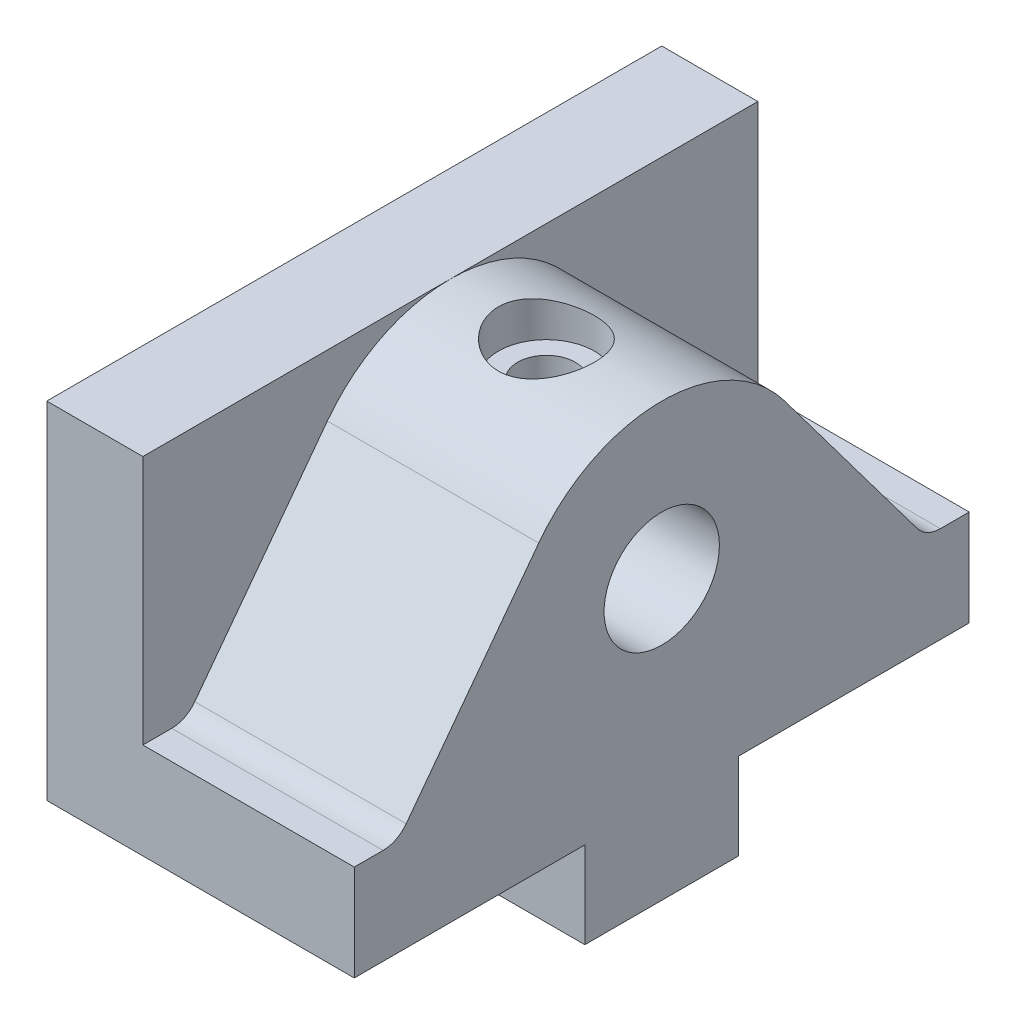
ISO-10303-21;
HEADER;
FILE_DESCRIPTION(('STEP AP214'),'2;1');
FILE_NAME('part.step','',(''),(''),'','','');
FILE_SCHEMA(('AUTOMOTIVE_DESIGN { 1 0 10303 214 1 1 1 1 }'));
ENDSEC;
DATA;
#1=APPLICATION_CONTEXT('core data for automotive mechanical design processes');
#2=APPLICATION_PROTOCOL_DEFINITION('international standard','automotive_design',2000,#1);
#3=PRODUCT_CONTEXT('',#1,'mechanical');
#4=PRODUCT('Part','Part','',(#3));
#5=PRODUCT_RELATED_PRODUCT_CATEGORY('part','',(#4));
#6=PRODUCT_DEFINITION_FORMATION('','',#4);
#7=PRODUCT_DEFINITION_CONTEXT('part definition',#1,'design');
#8=PRODUCT_DEFINITION('design','',#6,#7);
#9=PRODUCT_DEFINITION_SHAPE('','',#8);
#10=(LENGTH_UNIT() NAMED_UNIT(*) SI_UNIT(.MILLI.,.METRE.));
#11=(NAMED_UNIT(*) PLANE_ANGLE_UNIT() SI_UNIT($,.RADIAN.));
#12=(NAMED_UNIT(*) SI_UNIT($,.STERADIAN.) SOLID_ANGLE_UNIT());
#13=UNCERTAINTY_MEASURE_WITH_UNIT(LENGTH_MEASURE(1.E-05),#10,'distance_accuracy_value','');
#14=(GEOMETRIC_REPRESENTATION_CONTEXT(3) GLOBAL_UNCERTAINTY_ASSIGNED_CONTEXT((#13)) GLOBAL_UNIT_ASSIGNED_CONTEXT((#10,
#11,#12)) REPRESENTATION_CONTEXT('',''));
#15=CARTESIAN_POINT('',(0.,0.,0.));
#16=DIRECTION('',(0.,0.,1.));
#17=DIRECTION('',(1.,0.,0.));
#18=AXIS2_PLACEMENT_3D('',#15,#16,#17);
#19=CARTESIAN_POINT('',(10.,0.,0.));
#20=DIRECTION('',(-1.,0.,0.));
#21=DIRECTION('',(0.,0.,1.));
#22=AXIS2_PLACEMENT_3D('',#19,#20,#21);
#23=PLANE('',#22);
#24=DIRECTION('',(0.,0.,1.));
#25=VECTOR('',#24,1.);
#26=CARTESIAN_POINT('',(10.,19.,32.));
#27=LINE('',#26,#25);
#28=CARTESIAN_POINT('',(10.,19.,28.9999992365544));
#29=VERTEX_POINT('',#28);
#30=CARTESIAN_POINT('',(10.,19.,32.));
#31=VERTEX_POINT('',#30);
#32=EDGE_CURVE('E353',#29,#31,#27,.T.);
#33=ORIENTED_EDGE('',*,*,#32,.F.);
#34=CARTESIAN_POINT('',(10.,22.,28.9999992365544));
#35=DIRECTION('',(-1.,0.,0.));
#36=DIRECTION('',(0.,0.,1.));
#37=AXIS2_PLACEMENT_3D('',#34,#35,#36);
#38=CIRCLE('',#37,3.);
#39=CARTESIAN_POINT('',(10.,20.1999990227897,26.5999999694625));
#40=VERTEX_POINT('',#39);
#41=EDGE_CURVE('E69',#29,#40,#38,.F.);
#42=ORIENTED_EDGE('',*,*,#41,.T.);
#43=DIRECTION('',(0.,-0.799999755697321,0.600000325736768));
#44=VECTOR('',#43,1.);
#45=CARTESIAN_POINT('',(10.,19.,27.5));
#46=LINE('',#45,#44);
#47=CARTESIAN_POINT('',(10.,38.6000052117883,12.7999836215391));
#48=VERTEX_POINT('',#47);
#49=EDGE_CURVE('E346',#48,#40,#46,.T.);
#50=ORIENTED_EDGE('',*,*,#49,.F.);
#51=CARTESIAN_POINT('',(10.,29.,-1.24696180030942E-05));
#52=DIRECTION('',(1.,0.,0.));
#53=DIRECTION('',(0.,0.,1.));
#54=AXIS2_PLACEMENT_3D('',#51,#52,#53);
#55=CIRCLE('',#54,16.);
#56=CARTESIAN_POINT('',(10.,45.,-1.24696180030942E-05));
#57=VERTEX_POINT('',#56);
#58=EDGE_CURVE('E241',#57,#48,#55,.T.);
#59=ORIENTED_EDGE('',*,*,#58,.F.);
#60=DIRECTION('',(0.,0.,1.));
#61=VECTOR('',#60,1.);
#62=CARTESIAN_POINT('',(10.,45.,32.));
#63=LINE('',#62,#61);
#64=CARTESIAN_POINT('',(10.,45.,32.));
#65=VERTEX_POINT('',#64);
#66=EDGE_CURVE('E382',#57,#65,#63,.T.);
#67=ORIENTED_EDGE('',*,*,#66,.T.);
#68=DIRECTION('',(0.,-1.,0.));
#69=VECTOR('',#68,1.);
#70=CARTESIAN_POINT('',(10.,8.99999999999999,32.));
#71=LINE('',#70,#69);
#72=EDGE_CURVE('E374',#65,#31,#71,.T.);
#73=ORIENTED_EDGE('',*,*,#72,.T.);
#74=EDGE_LOOP('',(#33,#42,#50,#59,#67,#73));
#75=FACE_BOUND('',#74,.T.);
#76=ADVANCED_FACE('F45',(#75),#23,.F.);
#77=DIRECTION('',(0.,0.799999755697321,0.600000325736768));
#78=VECTOR('',#77,1.);
#79=CARTESIAN_POINT('',(10.,38.620207191916,-12.7848321235907));
#80=LINE('',#79,#78);
#81=CARTESIAN_POINT('',(10.,20.1999990227897,-26.5999999694624));
#82=VERTEX_POINT('',#81);
#83=CARTESIAN_POINT('',(10.,38.620207191916,-12.7848321235907));
#84=VERTEX_POINT('',#83);
#85=EDGE_CURVE('E334',#82,#84,#80,.T.);
#86=ORIENTED_EDGE('',*,*,#85,.F.);
#87=CARTESIAN_POINT('',(10.,22.,-28.9999992365544));
#88=DIRECTION('',(-1.,0.,0.));
#89=DIRECTION('',(0.,0.,1.));
#90=AXIS2_PLACEMENT_3D('',#87,#88,#89);
#91=CIRCLE('',#90,3.);
#92=CARTESIAN_POINT('',(10.,19.,-28.9999992365544));
#93=VERTEX_POINT('',#92);
#94=EDGE_CURVE('E327',#82,#93,#91,.F.);
#95=ORIENTED_EDGE('',*,*,#94,.T.);
#96=DIRECTION('',(0.,0.,1.));
#97=VECTOR('',#96,1.);
#98=CARTESIAN_POINT('',(10.,19.,-27.5));
#99=LINE('',#98,#97);
#100=CARTESIAN_POINT('',(10.,19.,-32.));
#101=VERTEX_POINT('',#100);
#102=EDGE_CURVE('E342',#101,#93,#99,.T.);
#103=ORIENTED_EDGE('',*,*,#102,.F.);
#104=DIRECTION('',(0.,1.,0.));
#105=VECTOR('',#104,1.);
#106=CARTESIAN_POINT('',(10.,45.,-32.));
#107=LINE('',#106,#105);
#108=CARTESIAN_POINT('',(10.,45.,-32.));
#109=VERTEX_POINT('',#108);
#110=EDGE_CURVE('E378',#101,#109,#107,.T.);
#111=ORIENTED_EDGE('',*,*,#110,.T.);
#112=EDGE_CURVE('E383',#109,#57,#63,.T.);
#113=ORIENTED_EDGE('',*,*,#112,.T.);
#114=EDGE_CURVE('E339',#84,#57,#55,.T.);
#115=ORIENTED_EDGE('',*,*,#114,.F.);
#116=EDGE_LOOP('',(#86,#95,#103,#111,#113,#115));
#117=FACE_BOUND('',#116,.T.);
#118=ADVANCED_FACE('F264',(#117),#23,.F.);
#119=CARTESIAN_POINT('',(10.,8.99999999999999,32.));
#120=DIRECTION('',(0.,0.,-1.));
#121=DIRECTION('',(-1.,0.,0.));
#122=AXIS2_PLACEMENT_3D('',#119,#120,#121);
#123=PLANE('',#122);
#124=DIRECTION('',(0.,-1.,0.));
#125=VECTOR('',#124,1.);
#126=CARTESIAN_POINT('',(0.,8.99999999999999,32.));
#127=LINE('',#126,#125);
#128=CARTESIAN_POINT('',(0.,45.,32.));
#129=VERTEX_POINT('',#128);
#130=CARTESIAN_POINT('',(0.,8.99999999999999,32.));
#131=VERTEX_POINT('',#130);
#132=EDGE_CURVE('E373',#129,#131,#127,.T.);
#133=ORIENTED_EDGE('',*,*,#132,.T.);
#134=DIRECTION('',(-1.,0.,0.));
#135=VECTOR('',#134,1.);
#136=CARTESIAN_POINT('',(10.,8.99999999999999,32.));
#137=LINE('',#136,#135);
#138=CARTESIAN_POINT('',(32.,8.99999999999999,32.));
#139=VERTEX_POINT('',#138);
#140=EDGE_CURVE('E242',#139,#131,#137,.T.);
#141=ORIENTED_EDGE('',*,*,#140,.F.);
#142=DIRECTION('',(0.,-1.,0.));
#143=VECTOR('',#142,1.);
#144=CARTESIAN_POINT('',(32.,19.,32.));
#145=LINE('',#144,#143);
#146=CARTESIAN_POINT('',(32.,19.,32.));
#147=VERTEX_POINT('',#146);
#148=EDGE_CURVE('E454',#147,#139,#145,.T.);
#149=ORIENTED_EDGE('',*,*,#148,.F.);
#150=DIRECTION('',(-1.,0.,0.));
#151=VECTOR('',#150,1.);
#152=CARTESIAN_POINT('',(32.,19.,32.));
#153=LINE('',#152,#151);
#154=EDGE_CURVE('E357',#147,#31,#153,.T.);
#155=ORIENTED_EDGE('',*,*,#154,.T.);
#156=ORIENTED_EDGE('',*,*,#72,.F.);
#157=DIRECTION('',(-1.,0.,0.));
#158=VECTOR('',#157,1.);
#159=CARTESIAN_POINT('',(10.,45.,32.));
#160=LINE('',#159,#158);
#161=EDGE_CURVE('E386',#65,#129,#160,.T.);
#162=ORIENTED_EDGE('',*,*,#161,.T.);
#163=EDGE_LOOP('',(#133,#141,#149,#155,#156,#162));
#164=FACE_BOUND('',#163,.T.);
#165=ADVANCED_FACE('F295',(#164),#123,.F.);
#166=CARTESIAN_POINT('',(10.,9.,8.));
#167=DIRECTION('',(0.,1.,0.));
#168=DIRECTION('',(0.,0.,1.));
#169=AXIS2_PLACEMENT_3D('',#166,#167,#168);
#170=PLANE('',#169);
#171=DIRECTION('',(0.,0.,-1.));
#172=VECTOR('',#171,1.);
#173=CARTESIAN_POINT('',(0.,9.,8.));
#174=LINE('',#173,#172);
#175=CARTESIAN_POINT('',(0.,9.,8.));
#176=VERTEX_POINT('',#175);
#177=EDGE_CURVE('E390',#131,#176,#174,.T.);
#178=ORIENTED_EDGE('',*,*,#177,.T.);
#179=DIRECTION('',(-1.,0.,0.));
#180=VECTOR('',#179,1.);
#181=CARTESIAN_POINT('',(10.,9.,8.));
#182=LINE('',#181,#180);
#183=CARTESIAN_POINT('',(32.,9.,8.));
#184=VERTEX_POINT('',#183);
#185=EDGE_CURVE('E432',#184,#176,#182,.T.);
#186=ORIENTED_EDGE('',*,*,#185,.F.);
#187=DIRECTION('',(0.,0.,-1.));
#188=VECTOR('',#187,1.);
#189=CARTESIAN_POINT('',(32.,8.99999999999999,32.));
#190=LINE('',#189,#188);
#191=EDGE_CURVE('E462',#139,#184,#190,.T.);
#192=ORIENTED_EDGE('',*,*,#191,.F.);
#193=ORIENTED_EDGE('',*,*,#140,.T.);
#194=EDGE_LOOP('',(#178,#186,#192,#193));
#195=FACE_BOUND('',#194,.T.);
#196=ADVANCED_FACE('F291',(#195),#170,.F.);
#197=CARTESIAN_POINT('',(10.,0.,8.));
#198=DIRECTION('',(0.,0.,-1.));
#199=DIRECTION('',(-1.,0.,0.));
#200=AXIS2_PLACEMENT_3D('',#197,#198,#199);
#201=PLANE('',#200);
#202=DIRECTION('',(0.,-1.,0.));
#203=VECTOR('',#202,1.);
#204=CARTESIAN_POINT('',(0.,0.,8.));
#205=LINE('',#204,#203);
#206=CARTESIAN_POINT('',(0.,0.,8.));
#207=VERTEX_POINT('',#206);
#208=EDGE_CURVE('E393',#176,#207,#205,.T.);
#209=ORIENTED_EDGE('',*,*,#208,.T.);
#210=DIRECTION('',(-1.,0.,0.));
#211=VECTOR('',#210,1.);
#212=CARTESIAN_POINT('',(10.,0.,8.));
#213=LINE('',#212,#211);
#214=CARTESIAN_POINT('',(32.,0.,8.));
#215=VERTEX_POINT('',#214);
#216=EDGE_CURVE('E429',#215,#207,#213,.T.);
#217=ORIENTED_EDGE('',*,*,#216,.F.);
#218=DIRECTION('',(0.,-1.,0.));
#219=VECTOR('',#218,1.);
#220=CARTESIAN_POINT('',(32.,9.,8.));
#221=LINE('',#220,#219);
#222=EDGE_CURVE('E466',#184,#215,#221,.T.);
#223=ORIENTED_EDGE('',*,*,#222,.F.);
#224=ORIENTED_EDGE('',*,*,#185,.T.);
#225=EDGE_LOOP('',(#209,#217,#223,#224));
#226=FACE_BOUND('',#225,.T.);
#227=ADVANCED_FACE('F287',(#226),#201,.F.);
#228=CARTESIAN_POINT('',(10.,0.,-8.));
#229=DIRECTION('',(0.,1.,0.));
#230=DIRECTION('',(0.,0.,1.));
#231=AXIS2_PLACEMENT_3D('',#228,#229,#230);
#232=PLANE('',#231);
#233=CARTESIAN_POINT('',(8.,0.,0.));
#234=DIRECTION('',(0.,-1.,0.));
#235=DIRECTION('',(0.,0.,-1.));
#236=AXIS2_PLACEMENT_3D('',#233,#234,#235);
#237=CIRCLE('',#236,2.99999999999999);
#238=CARTESIAN_POINT('',(8.,0.,-2.99999999999999));
#239=VERTEX_POINT('',#238);
#240=EDGE_CURVE('E178',#239,#239,#237,.T.);
#241=ORIENTED_EDGE('',*,*,#240,.F.);
#242=EDGE_LOOP('',(#241));
#243=FACE_BOUND('',#242,.T.);
#244=CARTESIAN_POINT('',(24.,0.,0.));
#245=DIRECTION('',(0.,-1.,0.));
#246=DIRECTION('',(0.,0.,-1.));
#247=AXIS2_PLACEMENT_3D('',#244,#245,#246);
#248=CIRCLE('',#247,2.99999999999999);
#249=CARTESIAN_POINT('',(24.,0.,-2.99999999999999));
#250=VERTEX_POINT('',#249);
#251=EDGE_CURVE('E177',#250,#250,#248,.T.);
#252=ORIENTED_EDGE('',*,*,#251,.F.);
#253=EDGE_LOOP('',(#252));
#254=FACE_BOUND('',#253,.T.);
#255=DIRECTION('',(0.,0.,-1.));
#256=VECTOR('',#255,1.);
#257=CARTESIAN_POINT('',(0.,0.,-8.));
#258=LINE('',#257,#256);
#259=CARTESIAN_POINT('',(0.,0.,-8.));
#260=VERTEX_POINT('',#259);
#261=EDGE_CURVE('E396',#207,#260,#258,.T.);
#262=ORIENTED_EDGE('',*,*,#261,.T.);
#263=DIRECTION('',(-1.,0.,0.));
#264=VECTOR('',#263,1.);
#265=CARTESIAN_POINT('',(10.,0.,-8.));
#266=LINE('',#265,#264);
#267=CARTESIAN_POINT('',(32.,0.,-8.));
#268=VERTEX_POINT('',#267);
#269=EDGE_CURVE('E425',#268,#260,#266,.T.);
#270=ORIENTED_EDGE('',*,*,#269,.F.);
#271=DIRECTION('',(0.,0.,-1.));
#272=VECTOR('',#271,1.);
#273=CARTESIAN_POINT('',(32.,0.,8.));
#274=LINE('',#273,#272);
#275=EDGE_CURVE('E470',#215,#268,#274,.T.);
#276=ORIENTED_EDGE('',*,*,#275,.F.);
#277=ORIENTED_EDGE('',*,*,#216,.T.);
#278=EDGE_LOOP('',(#262,#270,#276,#277));
#279=FACE_BOUND('',#278,.T.);
#280=ADVANCED_FACE('F283',(#243,#254,#279),#232,.F.);
#281=CARTESIAN_POINT('',(10.,9.,-8.));
#282=DIRECTION('',(0.,0.,1.));
#283=DIRECTION('',(1.,0.,0.));
#284=AXIS2_PLACEMENT_3D('',#281,#282,#283);
#285=PLANE('',#284);
#286=DIRECTION('',(0.,1.,0.));
#287=VECTOR('',#286,1.);
#288=CARTESIAN_POINT('',(0.,9.,-8.));
#289=LINE('',#288,#287);
#290=CARTESIAN_POINT('',(0.,9.,-8.));
#291=VERTEX_POINT('',#290);
#292=EDGE_CURVE('E399',#260,#291,#289,.T.);
#293=ORIENTED_EDGE('',*,*,#292,.T.);
#294=DIRECTION('',(-1.,0.,0.));
#295=VECTOR('',#294,1.);
#296=CARTESIAN_POINT('',(10.,9.,-8.));
#297=LINE('',#296,#295);
#298=CARTESIAN_POINT('',(32.,9.,-8.));
#299=VERTEX_POINT('',#298);
#300=EDGE_CURVE('E421',#299,#291,#297,.T.);
#301=ORIENTED_EDGE('',*,*,#300,.F.);
#302=DIRECTION('',(0.,1.,0.));
#303=VECTOR('',#302,1.);
#304=CARTESIAN_POINT('',(32.,0.,-8.));
#305=LINE('',#304,#303);
#306=EDGE_CURVE('E362',#268,#299,#305,.T.);
#307=ORIENTED_EDGE('',*,*,#306,.F.);
#308=ORIENTED_EDGE('',*,*,#269,.T.);
#309=EDGE_LOOP('',(#293,#301,#307,#308));
#310=FACE_BOUND('',#309,.T.);
#311=ADVANCED_FACE('F279',(#310),#285,.F.);
#312=CARTESIAN_POINT('',(10.,8.99999999999999,-32.));
#313=DIRECTION('',(0.,1.,0.));
#314=DIRECTION('',(0.,0.,1.));
#315=AXIS2_PLACEMENT_3D('',#312,#313,#314);
#316=PLANE('',#315);
#317=DIRECTION('',(0.,0.,-1.));
#318=VECTOR('',#317,1.);
#319=CARTESIAN_POINT('',(0.,8.99999999999999,-32.));
#320=LINE('',#319,#318);
#321=CARTESIAN_POINT('',(0.,8.99999999999999,-32.));
#322=VERTEX_POINT('',#321);
#323=EDGE_CURVE('E402',#291,#322,#320,.T.);
#324=ORIENTED_EDGE('',*,*,#323,.T.);
#325=DIRECTION('',(-1.,0.,0.));
#326=VECTOR('',#325,1.);
#327=CARTESIAN_POINT('',(10.,8.99999999999999,-32.));
#328=LINE('',#327,#326);
#329=CARTESIAN_POINT('',(32.,8.99999999999999,-32.));
#330=VERTEX_POINT('',#329);
#331=EDGE_CURVE('E417',#330,#322,#328,.T.);
#332=ORIENTED_EDGE('',*,*,#331,.F.);
#333=DIRECTION('',(0.,0.,-1.));
#334=VECTOR('',#333,1.);
#335=CARTESIAN_POINT('',(32.,9.,-8.));
#336=LINE('',#335,#334);
#337=EDGE_CURVE('E356',#299,#330,#336,.T.);
#338=ORIENTED_EDGE('',*,*,#337,.F.);
#339=ORIENTED_EDGE('',*,*,#300,.T.);
#340=EDGE_LOOP('',(#324,#332,#338,#339));
#341=FACE_BOUND('',#340,.T.);
#342=ADVANCED_FACE('F275',(#341),#316,.F.);
#343=CARTESIAN_POINT('',(10.,45.,-32.));
#344=DIRECTION('',(0.,0.,1.));
#345=DIRECTION('',(1.,0.,0.));
#346=AXIS2_PLACEMENT_3D('',#343,#344,#345);
#347=PLANE('',#346);
#348=DIRECTION('',(0.,1.,0.));
#349=VECTOR('',#348,1.);
#350=CARTESIAN_POINT('',(0.,45.,-32.));
#351=LINE('',#350,#349);
#352=CARTESIAN_POINT('',(0.,45.,-32.));
#353=VERTEX_POINT('',#352);
#354=EDGE_CURVE('E405',#322,#353,#351,.T.);
#355=ORIENTED_EDGE('',*,*,#354,.T.);
#356=DIRECTION('',(-1.,0.,0.));
#357=VECTOR('',#356,1.);
#358=CARTESIAN_POINT('',(10.,45.,-32.));
#359=LINE('',#358,#357);
#360=EDGE_CURVE('E413',#109,#353,#359,.T.);
#361=ORIENTED_EDGE('',*,*,#360,.F.);
#362=ORIENTED_EDGE('',*,*,#110,.F.);
#363=DIRECTION('',(-1.,0.,0.));
#364=VECTOR('',#363,1.);
#365=CARTESIAN_POINT('',(32.,19.,-32.));
#366=LINE('',#365,#364);
#367=CARTESIAN_POINT('',(32.,19.,-32.));
#368=VERTEX_POINT('',#367);
#369=EDGE_CURVE('E369',#368,#101,#366,.T.);
#370=ORIENTED_EDGE('',*,*,#369,.F.);
#371=DIRECTION('',(0.,1.,0.));
#372=VECTOR('',#371,1.);
#373=CARTESIAN_POINT('',(32.,8.99999999999999,-32.));
#374=LINE('',#373,#372);
#375=EDGE_CURVE('E483',#330,#368,#374,.T.);
#376=ORIENTED_EDGE('',*,*,#375,.F.);
#377=ORIENTED_EDGE('',*,*,#331,.T.);
#378=EDGE_LOOP('',(#355,#361,#362,#370,#376,#377));
#379=FACE_BOUND('',#378,.T.);
#380=ADVANCED_FACE('F271',(#379),#347,.F.);
#381=CARTESIAN_POINT('',(10.,45.,32.));
#382=DIRECTION('',(0.,-1.,0.));
#383=DIRECTION('',(0.,0.,-1.));
#384=AXIS2_PLACEMENT_3D('',#381,#382,#383);
#385=PLANE('',#384);
#386=DIRECTION('',(0.,0.,1.));
#387=VECTOR('',#386,1.);
#388=CARTESIAN_POINT('',(0.,45.,32.));
#389=LINE('',#388,#387);
#390=EDGE_CURVE('E379',#353,#129,#389,.T.);
#391=ORIENTED_EDGE('',*,*,#390,.T.);
#392=ORIENTED_EDGE('',*,*,#161,.F.);
#393=ORIENTED_EDGE('',*,*,#66,.F.);
#394=ORIENTED_EDGE('',*,*,#112,.F.);
#395=ORIENTED_EDGE('',*,*,#360,.T.);
#396=EDGE_LOOP('',(#391,#392,#393,#394,#395));
#397=FACE_BOUND('',#396,.T.);
#398=ADVANCED_FACE('F267',(#397),#385,.F.);
#399=CARTESIAN_POINT('',(0.,0.,0.));
#400=DIRECTION('',(-1.,0.,0.));
#401=DIRECTION('',(0.,0.,1.));
#402=AXIS2_PLACEMENT_3D('',#399,#400,#401);
#403=PLANE('',#402);
#404=ORIENTED_EDGE('',*,*,#132,.F.);
#405=ORIENTED_EDGE('',*,*,#390,.F.);
#406=ORIENTED_EDGE('',*,*,#354,.F.);
#407=ORIENTED_EDGE('',*,*,#323,.F.);
#408=ORIENTED_EDGE('',*,*,#292,.F.);
#409=ORIENTED_EDGE('',*,*,#261,.F.);
#410=ORIENTED_EDGE('',*,*,#208,.F.);
#411=ORIENTED_EDGE('',*,*,#177,.F.);
#412=EDGE_LOOP('',(#404,#405,#406,#407,#408,#409,#410,#411));
#413=FACE_BOUND('',#412,.T.);
#414=ADVANCED_FACE('F260',(#413),#403,.T.);
#415=CARTESIAN_POINT('',(32.,19.,-27.5));
#416=DIRECTION('',(0.,-1.,0.));
#417=DIRECTION('',(0.,0.,-1.));
#418=AXIS2_PLACEMENT_3D('',#415,#416,#417);
#419=PLANE('',#418);
#420=ORIENTED_EDGE('',*,*,#102,.T.);
#421=DIRECTION('',(-1.,0.,0.));
#422=VECTOR('',#421,1.);
#423=CARTESIAN_POINT('',(32.,19.,-28.9999992365544));
#424=LINE('',#423,#422);
#425=CARTESIAN_POINT('',(32.,19.,-28.9999992365544));
#426=VERTEX_POINT('',#425);
#427=EDGE_CURVE('E311',#93,#426,#424,.F.);
#428=ORIENTED_EDGE('',*,*,#427,.T.);
#429=DIRECTION('',(0.,0.,1.));
#430=VECTOR('',#429,1.);
#431=CARTESIAN_POINT('',(32.,19.,-27.5));
#432=LINE('',#431,#430);
#433=EDGE_CURVE('E486',#368,#426,#432,.T.);
#434=ORIENTED_EDGE('',*,*,#433,.F.);
#435=ORIENTED_EDGE('',*,*,#369,.T.);
#436=EDGE_LOOP('',(#420,#428,#434,#435));
#437=FACE_BOUND('',#436,.T.);
#438=ADVANCED_FACE('F256',(#437),#419,.F.);
#439=CARTESIAN_POINT('',(32.,38.620207191916,-12.7848321235907));
#440=DIRECTION('',(0.,-0.600000325736768,0.799999755697321));
#441=DIRECTION('',(0.,-0.799999755697321,-0.600000325736768));
#442=AXIS2_PLACEMENT_3D('',#439,#440,#441);
#443=PLANE('',#442);
#444=DIRECTION('',(0.,0.799999755697321,0.600000325736768));
#445=VECTOR('',#444,1.);
#446=CARTESIAN_POINT('',(32.,38.620207191916,-12.7848321235907));
#447=LINE('',#446,#445);
#448=CARTESIAN_POINT('',(32.,20.1999990227897,-26.5999999694624));
#449=VERTEX_POINT('',#448);
#450=CARTESIAN_POINT('',(32.,38.620207191916,-12.7848321235907));
#451=VERTEX_POINT('',#450);
#452=EDGE_CURVE('E336',#449,#451,#447,.T.);
#453=ORIENTED_EDGE('',*,*,#452,.F.);
#454=DIRECTION('',(-1.,0.,0.));
#455=VECTOR('',#454,1.);
#456=CARTESIAN_POINT('',(10.,20.1999990227897,-26.5999999694624));
#457=LINE('',#456,#455);
#458=EDGE_CURVE('E240',#449,#82,#457,.T.);
#459=ORIENTED_EDGE('',*,*,#458,.T.);
#460=ORIENTED_EDGE('',*,*,#85,.T.);
#461=DIRECTION('',(-1.,0.,0.));
#462=VECTOR('',#461,1.);
#463=CARTESIAN_POINT('',(32.,38.620207191916,-12.7848321235907));
#464=LINE('',#463,#462);
#465=EDGE_CURVE('E366',#451,#84,#464,.T.);
#466=ORIENTED_EDGE('',*,*,#465,.F.);
#467=EDGE_LOOP('',(#453,#459,#460,#466));
#468=FACE_BOUND('',#467,.T.);
#469=ADVANCED_FACE('F251',(#468),#443,.F.);
#470=CARTESIAN_POINT('',(32.,29.,-1.24696180030942E-05));
#471=DIRECTION('',(-1.,0.,0.));
#472=DIRECTION('',(0.,0.,1.));
#473=AXIS2_PLACEMENT_3D('',#470,#471,#472);
#474=CYLINDRICAL_SURFACE('',#473,16.);
#475=CARTESIAN_POINT('',(20.,44.1986800513618,5.));
#476=CARTESIAN_POINT('',(19.7266119005134,44.1986817366376,4.99999815121332));
#477=CARTESIAN_POINT('',(19.4532050151509,44.2061371761547,4.97750155896373));
#478=CARTESIAN_POINT('',(18.9144235365466,44.2350215467978,4.88836705342593));
#479=CARTESIAN_POINT('',(18.6490511342144,44.2564542540815,4.8217172114325));
#480=CARTESIAN_POINT('',(18.134220707827,44.3106337313561,4.64679165250141));
#481=CARTESIAN_POINT('',(17.8847354283473,44.343360470398,4.53858959397309));
#482=CARTESIAN_POINT('',(17.4073896611886,44.4164127098121,4.28387683220849));
#483=CARTESIAN_POINT('',(17.1795330034741,44.4567395522389,4.13735936131976));
#484=CARTESIAN_POINT('',(16.7440850477711,44.5420019460492,3.8047847233252));
#485=CARTESIAN_POINT('',(16.5373460793569,44.5870419267991,3.61763809108231));
#486=CARTESIAN_POINT('',(16.1576164516381,44.6757671565315,3.21144878639545));
#487=CARTESIAN_POINT('',(15.9846305047584,44.7194522156317,2.992401667613));
#488=CARTESIAN_POINT('',(15.6735561650297,44.8017400308061,2.52250436838036));
#489=CARTESIAN_POINT('',(15.5363455469645,44.8402054926972,2.27104694208608));
#490=CARTESIAN_POINT('',(15.3064960570214,44.9065006280297,1.74721762543102));
#491=CARTESIAN_POINT('',(15.2138467088048,44.9343328010368,1.47485066837183));
#492=CARTESIAN_POINT('',(15.0785955985284,44.9754862760719,0.92585803248301));
#493=CARTESIAN_POINT('',(15.034537069917,44.989229031338,0.649623416396143));
#494=CARTESIAN_POINT('',(14.9931026190012,45.0021437608435,0.0933636922220872));
#495=CARTESIAN_POINT('',(14.9957160847839,45.0013190473204,-0.186660539743215));
#496=CARTESIAN_POINT('',(15.0465931251613,44.9854852292155,-0.732297651168507));
#497=CARTESIAN_POINT('',(15.093277483442,44.9709668334435,-0.998074297171011));
#498=CARTESIAN_POINT('',(15.2283799035353,44.9299805072516,-1.51781208090938));
#499=CARTESIAN_POINT('',(15.3168006870701,44.9035117975309,-1.77177244689346));
#500=CARTESIAN_POINT('',(15.5338807008535,44.8409401869116,-2.26431230114393));
#501=CARTESIAN_POINT('',(15.6630191650707,44.8047233378728,-2.50266550107998));
#502=CARTESIAN_POINT('',(15.9574843000154,44.7264712861081,-2.95480990809369));
#503=CARTESIAN_POINT('',(16.1228201218313,44.6844346130565,-3.168594883176));
#504=CARTESIAN_POINT('',(16.4930943713366,44.5969497251355,-3.5749506260031));
#505=CARTESIAN_POINT('',(16.6993960670478,44.5514323437398,-3.7662660104659));
#506=CARTESIAN_POINT('',(17.141580106102,44.4636279894978,-4.1119587579664));
#507=CARTESIAN_POINT('',(17.3774659286827,44.421341397551,-4.26633177018075));
#508=CARTESIAN_POINT('',(17.8756694333163,44.3444376122366,-4.53521839247508));
#509=CARTESIAN_POINT('',(18.1382531606624,44.3099114568146,-4.64926703591609));
#510=CARTESIAN_POINT('',(18.6802374204162,44.2535058083539,-4.83113368684027));
#511=CARTESIAN_POINT('',(18.9596318714447,44.2316217719653,-4.89896830438608));
#512=CARTESIAN_POINT('',(19.5152792218087,44.2039866421033,-4.98405935244681));
#513=CARTESIAN_POINT('',(19.7912074336206,44.1976227677476,-5.00323815331199));
#514=CARTESIAN_POINT('',(20.3423584944645,44.2000471854892,-4.99586981443159));
#515=CARTESIAN_POINT('',(20.6175814459055,44.2088331363175,-4.96932974012687));
#516=CARTESIAN_POINT('',(21.1512328784774,44.2399622619191,-4.87299501728831));
#517=CARTESIAN_POINT('',(21.4099168651395,44.2619060667887,-4.80447331858126));
#518=CARTESIAN_POINT('',(21.9120870895638,44.3164552495702,-4.62761498331503));
#519=CARTESIAN_POINT('',(22.1555708410337,44.3490623662596,-4.51927185304883));
#520=CARTESIAN_POINT('',(22.6281565505771,44.4224250504429,-4.26230036071327));
#521=CARTESIAN_POINT('',(22.856645814957,44.4633874832866,-4.11260579733282));
#522=CARTESIAN_POINT('',(23.2859616114711,44.5484170360498,-3.77842544220824));
#523=CARTESIAN_POINT('',(23.4867809340956,44.5924849606136,-3.59393061267296));
#524=CARTESIAN_POINT('',(23.8636417277056,44.6809701010528,-3.18629147061523));
#525=CARTESIAN_POINT('',(24.0383113894329,44.7253261026466,-2.96186226513634));
#526=CARTESIAN_POINT('',(24.3475643768355,44.807564410311,-2.48580582634131));
#527=CARTESIAN_POINT('',(24.4821495387033,44.8454470128814,-2.2341798395763));
#528=CARTESIAN_POINT('',(24.7061223694753,44.9102538544437,-1.71242175732318));
#529=CARTESIAN_POINT('',(24.7958372371829,44.9372571366823,-1.44244044125717));
#530=CARTESIAN_POINT('',(24.9282901872172,44.9776104106733,-0.890228817421853));
#531=CARTESIAN_POINT('',(24.9710429699855,44.9909646748576,-0.608002371491561));
#532=CARTESIAN_POINT('',(25.0071640053555,45.0022321760637,-0.0519397064211323));
#533=CARTESIAN_POINT('',(25.0025137981708,45.000765002808,0.221756764060822));
#534=CARTESIAN_POINT('',(24.9487527685832,44.9840385310698,0.764292787815872));
#535=CARTESIAN_POINT('',(24.8996448449182,44.9687801318048,1.03313265658412));
#536=CARTESIAN_POINT('',(24.7596240293497,44.926381636381,1.55502027096947));
#537=CARTESIAN_POINT('',(24.6692416471804,44.8993925237886,1.80822346975252));
#538=CARTESIAN_POINT('',(24.4497167980769,44.8363160461579,2.29599349395294));
#539=CARTESIAN_POINT('',(24.3205676830116,44.8002271207569,2.5305571141244));
#540=CARTESIAN_POINT('',(24.0221091015908,44.721193544196,2.98304660072933));
#541=CARTESIAN_POINT('',(23.8515860355414,44.6780578758104,3.20013827996744));
#542=CARTESIAN_POINT('',(23.4773605382673,44.5903466016912,3.60328307529905));
#543=CARTESIAN_POINT('',(23.2736481796746,44.5457705683328,3.78932687073974));
#544=CARTESIAN_POINT('',(22.8307371452438,44.4584723747749,4.13131462200964));
#545=CARTESIAN_POINT('',(22.5905863800637,44.4158605646548,4.28605712717877));
#546=CARTESIAN_POINT('',(22.0864074332348,44.3392012969705,4.55281887178237));
#547=CARTESIAN_POINT('',(21.8223889624261,44.3051503774447,4.6648553906968));
#548=CARTESIAN_POINT('',(21.3011093787756,44.2522584524333,4.83484725638986));
#549=CARTESIAN_POINT('',(21.0451896893289,44.2323685843457,4.89659761763817));
#550=CARTESIAN_POINT('',(20.5261846117469,44.2055801732117,4.9791698372596));
#551=CARTESIAN_POINT('',(20.2631010052325,44.1986784294999,5.00000177922021));
#552=CARTESIAN_POINT('',(20.,44.1986800513618,5.));
#553=B_SPLINE_CURVE_WITH_KNOTS('',3,(#475,#476,#477,#478,#479,#480,#481,#482,#483,#484,#485,
#486,#487,#488,#489,#490,#491,#492,#493,#494,#495,#496,#497,#498,#499,#500,#501,#502,#503,#504,
#505,#506,#507,#508,#509,#510,#511,#512,#513,#514,#515,#516,#517,#518,#519,#520,#521,#522,#523,
#524,#525,#526,#527,#528,#529,#530,#531,#532,#533,#534,#535,#536,#537,#538,#539,#540,#541,#542,
#543,#544,#545,#546,#547,#548,#549,#550,#551,#552),.UNSPECIFIED.,.T.,.F.,(4,2,2,2,2,2,2,2,2,2,2,
2,2,2,2,2,2,2,2,2,2,2,2,2,2,2,2,2,2,2,2,2,2,2,2,2,2,2,4),(0.,0.819192415228676,1.63860623867163,
2.45657416646422,3.2746866696562,4.11828264557197,4.96199631591608,5.82479244654169,
6.687385634831,7.52334885111299,8.35912199503923,9.16603950366854,9.97300964039911,
10.789856294054,11.6069096944475,12.4580133398968,13.3092171733141,14.1699383120462,
15.03034993035,15.8561968220029,16.6819160978974,17.4837587005908,18.2857321183396,
19.110704666829,19.9358917602537,20.7952776620508,21.6546241910065,22.5076094226851,
23.360327570056,24.1775516156882,24.9947223804072,25.8016732976293,26.6087626785035,
27.4432273798992,28.277942140816,29.1403118257215,30.0023322116511,30.7908942652294,
31.5792619678846),.UNSPECIFIED.);
#554=CARTESIAN_POINT('',(20.,44.1986800513618,5.));
#555=VERTEX_POINT('',#554);
#556=EDGE_CURVE('E231',#555,#555,#553,.T.);
#557=ORIENTED_EDGE('',*,*,#556,.T.);
#558=EDGE_LOOP('',(#557));
#559=FACE_BOUND('',#558,.T.);
#560=ORIENTED_EDGE('',*,*,#114,.T.);
#561=ORIENTED_EDGE('',*,*,#58,.T.);
#562=DIRECTION('',(-1.,0.,0.));
#563=VECTOR('',#562,1.);
#564=CARTESIAN_POINT('',(32.,38.6000052117883,12.7999836215391));
#565=LINE('',#564,#563);
#566=CARTESIAN_POINT('',(32.,38.6000052117883,12.7999836215391));
#567=VERTEX_POINT('',#566);
#568=EDGE_CURVE('E361',#567,#48,#565,.T.);
#569=ORIENTED_EDGE('',*,*,#568,.F.);
#570=CARTESIAN_POINT('',(32.,29.,-1.24696180030942E-05));
#571=DIRECTION('',(1.,0.,0.));
#572=DIRECTION('',(0.,0.,1.));
#573=AXIS2_PLACEMENT_3D('',#570,#571,#572);
#574=CIRCLE('',#573,16.);
#575=EDGE_CURVE('E450',#451,#567,#574,.T.);
#576=ORIENTED_EDGE('',*,*,#575,.F.);
#577=ORIENTED_EDGE('',*,*,#465,.T.);
#578=EDGE_LOOP('',(#560,#561,#569,#576,#577));
#579=FACE_BOUND('',#578,.T.);
#580=ADVANCED_FACE('F245',(#559,#579),#474,.T.);
#581=CARTESIAN_POINT('',(32.,19.,27.5));
#582=DIRECTION('',(0.,-0.600000325736768,-0.799999755697321));
#583=DIRECTION('',(0.,0.799999755697321,-0.600000325736768));
#584=AXIS2_PLACEMENT_3D('',#581,#582,#583);
#585=PLANE('',#584);
#586=ORIENTED_EDGE('',*,*,#49,.T.);
#587=DIRECTION('',(-1.,0.,0.));
#588=VECTOR('',#587,1.);
#589=CARTESIAN_POINT('',(32.,20.1999990227897,26.5999999694625));
#590=LINE('',#589,#588);
#591=CARTESIAN_POINT('',(32.,20.1999990227897,26.5999999694625));
#592=VERTEX_POINT('',#591);
#593=EDGE_CURVE('E61',#40,#592,#590,.F.);
#594=ORIENTED_EDGE('',*,*,#593,.T.);
#595=DIRECTION('',(0.,-0.799999755697321,0.600000325736768));
#596=VECTOR('',#595,1.);
#597=CARTESIAN_POINT('',(32.,19.,27.5));
#598=LINE('',#597,#596);
#599=EDGE_CURVE('E446',#567,#592,#598,.T.);
#600=ORIENTED_EDGE('',*,*,#599,.F.);
#601=ORIENTED_EDGE('',*,*,#568,.T.);
#602=EDGE_LOOP('',(#586,#594,#600,#601));
#603=FACE_BOUND('',#602,.T.);
#604=ADVANCED_FACE('F250',(#603),#585,.F.);
#605=CARTESIAN_POINT('',(32.,19.,32.));
#606=DIRECTION('',(0.,-1.,0.));
#607=DIRECTION('',(0.,0.,-1.));
#608=AXIS2_PLACEMENT_3D('',#605,#606,#607);
#609=PLANE('',#608);
#610=DIRECTION('',(0.,0.,1.));
#611=VECTOR('',#610,1.);
#612=CARTESIAN_POINT('',(32.,19.,32.));
#613=LINE('',#612,#611);
#614=CARTESIAN_POINT('',(32.,19.,28.9999992365544));
#615=VERTEX_POINT('',#614);
#616=EDGE_CURVE('E449',#615,#147,#613,.T.);
#617=ORIENTED_EDGE('',*,*,#616,.F.);
#618=DIRECTION('',(-1.,0.,0.));
#619=VECTOR('',#618,1.);
#620=CARTESIAN_POINT('',(10.,19.,28.9999992365544));
#621=LINE('',#620,#619);
#622=EDGE_CURVE('E322',#615,#29,#621,.T.);
#623=ORIENTED_EDGE('',*,*,#622,.T.);
#624=ORIENTED_EDGE('',*,*,#32,.T.);
#625=ORIENTED_EDGE('',*,*,#154,.F.);
#626=EDGE_LOOP('',(#617,#623,#624,#625));
#627=FACE_BOUND('',#626,.T.);
#628=ADVANCED_FACE('F505',(#627),#609,.F.);
#629=CARTESIAN_POINT('',(32.,29.,-1.24696180030942E-05));
#630=DIRECTION('',(-1.,0.,0.));
#631=DIRECTION('',(0.,0.,1.));
#632=AXIS2_PLACEMENT_3D('',#629,#630,#631);
#633=PLANE('',#632);
#634=CARTESIAN_POINT('',(32.,29.,-1.24696180030942E-05));
#635=DIRECTION('',(1.,0.,0.));
#636=DIRECTION('',(0.,0.,-1.));
#637=AXIS2_PLACEMENT_3D('',#634,#635,#636);
#638=CIRCLE('',#637,6.);
#639=CARTESIAN_POINT('',(32.,29.,-6.000012469618));
#640=VERTEX_POINT('',#639);
#641=EDGE_CURVE('E208',#640,#640,#638,.T.);
#642=ORIENTED_EDGE('',*,*,#641,.F.);
#643=EDGE_LOOP('',(#642));
#644=FACE_BOUND('',#643,.T.);
#645=ORIENTED_EDGE('',*,*,#337,.T.);
#646=ORIENTED_EDGE('',*,*,#375,.T.);
#647=ORIENTED_EDGE('',*,*,#433,.T.);
#648=CARTESIAN_POINT('',(32.,22.,-28.9999992365544));
#649=DIRECTION('',(-1.,0.,0.));
#650=DIRECTION('',(0.,0.,1.));
#651=AXIS2_PLACEMENT_3D('',#648,#649,#650);
#652=CIRCLE('',#651,3.);
#653=EDGE_CURVE('E54',#426,#449,#652,.T.);
#654=ORIENTED_EDGE('',*,*,#653,.T.);
#655=ORIENTED_EDGE('',*,*,#452,.T.);
#656=ORIENTED_EDGE('',*,*,#575,.T.);
#657=ORIENTED_EDGE('',*,*,#599,.T.);
#658=CARTESIAN_POINT('',(32.,22.,28.9999992365544));
#659=DIRECTION('',(-1.,0.,0.));
#660=DIRECTION('',(0.,0.,1.));
#661=AXIS2_PLACEMENT_3D('',#658,#659,#660);
#662=CIRCLE('',#661,3.);
#663=EDGE_CURVE('E11',#592,#615,#662,.T.);
#664=ORIENTED_EDGE('',*,*,#663,.T.);
#665=ORIENTED_EDGE('',*,*,#616,.T.);
#666=ORIENTED_EDGE('',*,*,#148,.T.);
#667=ORIENTED_EDGE('',*,*,#191,.T.);
#668=ORIENTED_EDGE('',*,*,#222,.T.);
#669=ORIENTED_EDGE('',*,*,#275,.T.);
#670=ORIENTED_EDGE('',*,*,#306,.T.);
#671=EDGE_LOOP('',(#645,#646,#647,#654,#655,#656,#657,#664,#665,#666,#667,#668,#669,#670));
#672=FACE_BOUND('',#671,.T.);
#673=ADVANCED_FACE('F478',(#644,#672),#633,.F.);
#674=CARTESIAN_POINT('',(8.,29.,-1.24696180030942E-05));
#675=DIRECTION('',(1.,0.,0.));
#676=DIRECTION('',(0.,0.,-1.));
#677=AXIS2_PLACEMENT_3D('',#674,#675,#676);
#678=CYLINDRICAL_SURFACE('',#677,6.);
#679=CARTESIAN_POINT('',(20.,34.1961452233494,3.));
#680=CARTESIAN_POINT('',(20.0782001731301,34.1961461821613,2.99999910875618));
#681=CARTESIAN_POINT('',(20.1564098782382,34.1979186196539,2.99693611676696));
#682=CARTESIAN_POINT('',(20.3122078344849,34.204932152413,2.98473567732852));
#683=CARTESIAN_POINT('',(20.3897957792773,34.2101748625155,2.97559540190324));
#684=CARTESIAN_POINT('',(20.6209435319291,34.230874945476,2.93916921782074));
#685=CARTESIAN_POINT('',(20.7727503065966,34.2513037879895,2.90287821148393));
#686=CARTESIAN_POINT('',(21.0663907844068,34.3024706982473,2.80830029547981));
#687=CARTESIAN_POINT('',(21.2082728293944,34.3331538691668,2.75013031178843));
#688=CARTESIAN_POINT('',(21.4802615578569,34.4012743692155,2.61380321208971));
#689=CARTESIAN_POINT('',(21.6103676037771,34.4387120637077,2.5356450147923));
#690=CARTESIAN_POINT('',(21.8669187190259,34.5199000373518,2.35400075796746));
#691=CARTESIAN_POINT('',(21.9921767611109,34.5639162915166,2.24895738006763));
#692=CARTESIAN_POINT('',(22.2242229312184,34.6511545261622,2.0197629954302));
#693=CARTESIAN_POINT('',(22.3310018461877,34.6943761009009,1.89560251552526));
#694=CARTESIAN_POINT('',(22.5301004573033,34.7786402523437,1.62147061883029));
#695=CARTESIAN_POINT('',(22.6209602874706,34.8193395517387,1.47032349954176));
#696=CARTESIAN_POINT('',(22.7754217166522,34.8905198810165,1.15247297265334));
#697=CARTESIAN_POINT('',(22.8390405180895,34.9210073569015,0.985779463678511));
#698=CARTESIAN_POINT('',(22.9325136340361,34.9664122904647,0.654136498587344));
#699=CARTESIAN_POINT('',(22.9644483364031,34.9822832645463,0.489906901461899));
#700=CARTESIAN_POINT('',(23.0004983013923,35.0002271615471,0.157713094375431));
#701=CARTESIAN_POINT('',(23.0046303968132,35.0023084332863,-0.0102487940891892));
#702=CARTESIAN_POINT('',(22.9857600532963,34.9928901844461,-0.329496828150589));
#703=CARTESIAN_POINT('',(22.9650860245305,34.9825559299897,-0.480962943458135));
#704=CARTESIAN_POINT('',(22.9013576437195,34.9512290565878,-0.777940821031553));
#705=CARTESIAN_POINT('',(22.8583016170326,34.9302356401167,-0.923452136874916));
#706=CARTESIAN_POINT('',(22.7507522729473,34.8791501014514,-1.20692792409562));
#707=CARTESIAN_POINT('',(22.6859706207951,34.8489361207114,-1.34476013806634));
#708=CARTESIAN_POINT('',(22.5372105387967,34.7821329919464,-1.60792992224418));
#709=CARTESIAN_POINT('',(22.4532252362667,34.7455415626505,-1.73326299608761));
#710=CARTESIAN_POINT('',(22.259311831816,34.6653360648248,-1.98052133194209));
#711=CARTESIAN_POINT('',(22.1476818745881,34.6213851246541,-2.10100457188829));
#712=CARTESIAN_POINT('',(21.9062408256465,34.5336366090534,-2.32230988877124));
#713=CARTESIAN_POINT('',(21.7764158766395,34.4898391768408,-2.42311683892235));
#714=CARTESIAN_POINT('',(21.4920187533235,34.4043271135742,-2.60852643563458));
#715=CARTESIAN_POINT('',(21.3363985839356,34.3629213730664,-2.69169351446048));
#716=CARTESIAN_POINT('',(21.0924381726115,34.3091587629092,-2.7954278937954));
#717=CARTESIAN_POINT('',(21.0093449893527,34.2926263731789,-2.82650750719011));
#718=CARTESIAN_POINT('',(20.8401928485073,34.2629917940492,-2.8813125500316));
#719=CARTESIAN_POINT('',(20.7541357563021,34.2498874902139,-2.90504251439531));
#720=CARTESIAN_POINT('',(20.5866299669228,34.2285617568523,-2.94323896449741));
#721=CARTESIAN_POINT('',(20.5053521359627,34.2200370401271,-2.95828784122127));
#722=CARTESIAN_POINT('',(20.3415662696725,34.2067346108067,-2.98163886013903));
#723=CARTESIAN_POINT('',(20.2590588968731,34.201954949667,-2.98994451090061));
#724=CARTESIAN_POINT('',(20.0935304148519,34.1963438520704,-2.99968659466892));
#725=CARTESIAN_POINT('',(20.010509508461,34.1955109454555,-3.00112558549385));
#726=CARTESIAN_POINT('',(19.8447148625441,34.1978166820506,-2.99712749484292));
#727=CARTESIAN_POINT('',(19.7619411067125,34.2009550571845,-2.99169087749585));
#728=CARTESIAN_POINT('',(19.5331419030068,34.2150519256869,-2.967101525922));
#729=CARTESIAN_POINT('',(19.3880900127988,34.2301985148317,-2.94056181299527));
#730=CARTESIAN_POINT('',(19.1048694799067,34.2708233741983,-2.86709080659163));
#731=CARTESIAN_POINT('',(18.9667030824886,34.2963049900978,-2.82015290941711));
#732=CARTESIAN_POINT('',(18.6937737186205,34.3560941388942,-2.70494216778735));
#733=CARTESIAN_POINT('',(18.559464754156,34.390755781742,-2.63578188682578));
#734=CARTESIAN_POINT('',(18.303589480975,34.4646891103103,-2.47886094523758));
#735=CARTESIAN_POINT('',(18.1820297662824,34.5039631595658,-2.39109072960726));
#736=CARTESIAN_POINT('',(17.9390635793019,34.5886452209938,-2.18651071088505));
#737=CARTESIAN_POINT('',(17.8196079515184,34.6342023954526,-2.06743498820526));
#738=CARTESIAN_POINT('',(17.6017623766291,34.7220312711716,-1.81021253709613));
#739=CARTESIAN_POINT('',(17.5033795451104,34.7643018596009,-1.67205939266911));
#740=CARTESIAN_POINT('',(17.3282783376254,34.8422440378367,-1.3756050327904));
#741=CARTESIAN_POINT('',(17.25220023135,34.8777120323523,-1.21686831074674));
#742=CARTESIAN_POINT('',(17.1285860382773,34.9365026227173,-0.886566301580194));
#743=CARTESIAN_POINT('',(17.0810248891513,34.9598358808657,-0.715012428488877));
#744=CARTESIAN_POINT('',(17.0198942599414,34.9900260628046,-0.380938622793733));
#745=CARTESIAN_POINT('',(17.0036063503261,34.9981983016049,-0.219034036569088));
#746=CARTESIAN_POINT('',(16.9974702197,35.0012636860775,0.105377978485945));
#747=CARTESIAN_POINT('',(17.0076127432712,34.9961614802003,0.26788517639266));
#748=CARTESIAN_POINT('',(17.0522491264128,34.9740178982751,0.577613628250122));
#749=CARTESIAN_POINT('',(17.0850943472321,34.9577853922399,0.72513652653466));
#750=CARTESIAN_POINT('',(17.1719809446855,34.915760731024,1.0123374446307));
#751=CARTESIAN_POINT('',(17.2260253610357,34.8899672049342,1.15201433613183));
#752=CARTESIAN_POINT('',(17.3561804486294,34.8297750951549,1.42626950067563));
#753=CARTESIAN_POINT('',(17.4331360504109,34.7950556496528,1.56037418027945));
#754=CARTESIAN_POINT('',(17.6058751131413,34.7206398101022,1.81432429247111));
#755=CARTESIAN_POINT('',(17.7016672216947,34.6809411331939,1.93416313507238));
#756=CARTESIAN_POINT('',(17.9203844450941,34.5958550603127,2.16873858145896));
#757=CARTESIAN_POINT('',(18.0450610943839,34.5502947091702,2.28178048180267));
#758=CARTESIAN_POINT('',(18.312378236292,34.4618808486099,2.4860022018278));
#759=CARTESIAN_POINT('',(18.4550344529569,34.4190297584447,2.57716267990455));
#760=CARTESIAN_POINT('',(18.6825319213033,34.3600414441044,2.69665565710003));
#761=CARTESIAN_POINT('',(18.7619759661076,34.3410057697412,2.73405416375879));
#762=CARTESIAN_POINT('',(18.9243535311595,34.3057211949223,2.80191267285204));
#763=CARTESIAN_POINT('',(19.0072852277878,34.2894708600896,2.83237624926272));
#764=CARTESIAN_POINT('',(19.1758451251019,34.2604452556602,2.88592635948004));
#765=CARTESIAN_POINT('',(19.2614657527063,34.2476610590631,2.90903187124696));
#766=CARTESIAN_POINT('',(19.4348558124913,34.2260816020585,2.94762438894921));
#767=CARTESIAN_POINT('',(19.5226236970636,34.2172835530503,2.96311672150248));
#768=CARTESIAN_POINT('',(19.6753993827064,34.2058781009151,2.98309387124786));
#769=CARTESIAN_POINT('',(19.7400952613473,34.2022372391021,2.98942749914915));
#770=CARTESIAN_POINT('',(19.8698585434192,34.1973703206089,2.99788107529379));
#771=CARTESIAN_POINT('',(19.9349259714129,34.1961444254771,3.00000074164574));
#772=CARTESIAN_POINT('',(20.,34.1961452233494,3.));
#773=B_SPLINE_CURVE_WITH_KNOTS('',3,(#679,#680,#681,#682,#683,#684,#685,#686,#687,#688,#689,
#690,#691,#692,#693,#694,#695,#696,#697,#698,#699,#700,#701,#702,#703,#704,#705,#706,#707,#708,
#709,#710,#711,#712,#713,#714,#715,#716,#717,#718,#719,#720,#721,#722,#723,#724,#725,#726,#727,
#728,#729,#730,#731,#732,#733,#734,#735,#736,#737,#738,#739,#740,#741,#742,#743,#744,#745,#746,
#747,#748,#749,#750,#751,#752,#753,#754,#755,#756,#757,#758,#759,#760,#761,#762,#763,#764,#765,
#766,#767,#768,#769,#770,#771,#772),.UNSPECIFIED.,.T.,.F.,(4,2,2,2,2,2,2,2,2,2,2,2,2,2,2,2,2,2,
2,2,2,2,2,2,2,2,2,2,2,2,2,2,2,2,2,2,2,2,2,2,2,2,2,2,2,2,4),(0.,0.234529250380492,
0.46916771201136,0.938849663112719,1.40605639749098,1.87328841141208,2.379057069379,
2.88507716416546,3.4252072862445,3.96499581699691,4.46637613289501,4.96745286597021,
5.42495524283711,5.88249185538246,6.34635828518841,6.81039098603983,7.31828724585778,
7.82657244264185,8.36713577561923,8.63752774771103,8.90775254729109,9.15669445910848,
9.40550676080834,9.65422637314498,9.90292919689107,10.3454325021927,10.7880791701283,
11.2512268603472,11.7146129254323,12.2364105239135,12.7583840394062,13.2941329752392,
13.8294103715489,14.3155746551897,14.8015687165392,15.2555388217256,15.7095740447126,
16.1830288436001,16.6567015092638,17.1775143587876,17.6987858879815,17.9680117197242,
18.2370984879113,18.5054854969279,18.7736844586557,18.9688341841045,19.163996963583),.UNSPECIFIED.);
#774=CARTESIAN_POINT('',(20.,34.1961452233494,3.));
#775=VERTEX_POINT('',#774);
#776=EDGE_CURVE('E199',#775,#775,#773,.T.);
#777=ORIENTED_EDGE('',*,*,#776,.T.);
#778=EDGE_LOOP('',(#777));
#779=FACE_BOUND('',#778,.T.);
#780=CARTESIAN_POINT('',(8.,29.,-1.24696180030942E-05));
#781=DIRECTION('',(1.,0.,0.));
#782=DIRECTION('',(0.,0.,-1.));
#783=AXIS2_PLACEMENT_3D('',#780,#781,#782);
#784=CIRCLE('',#783,6.);
#785=CARTESIAN_POINT('',(8.,29.,-6.000012469618));
#786=VERTEX_POINT('',#785);
#787=EDGE_CURVE('E209',#786,#786,#784,.T.);
#788=ORIENTED_EDGE('',*,*,#787,.F.);
#789=EDGE_LOOP('',(#788));
#790=FACE_BOUND('',#789,.T.);
#791=ORIENTED_EDGE('',*,*,#641,.T.);
#792=EDGE_LOOP('',(#791));
#793=FACE_BOUND('',#792,.T.);
#794=ADVANCED_FACE('F516',(#779,#790,#793),#678,.F.);
#795=CARTESIAN_POINT('',(8.,29.,-1.24696180030942E-05));
#796=DIRECTION('',(1.,0.,0.));
#797=DIRECTION('',(0.,0.,-1.));
#798=AXIS2_PLACEMENT_3D('',#795,#796,#797);
#799=PLANE('',#798);
#800=ORIENTED_EDGE('',*,*,#787,.T.);
#801=EDGE_LOOP('',(#800));
#802=FACE_BOUND('',#801,.T.);
#803=ADVANCED_FACE('F227',(#802),#799,.T.);
#804=CARTESIAN_POINT('',(20.,45.,0.));
#805=DIRECTION('',(0.,1.,0.));
#806=DIRECTION('',(0.,0.,1.));
#807=AXIS2_PLACEMENT_3D('',#804,#805,#806);
#808=CYLINDRICAL_SURFACE('',#807,5.);
#809=CARTESIAN_POINT('',(20.,41.,0.));
#810=DIRECTION('',(0.,1.,0.));
#811=DIRECTION('',(0.,0.,1.));
#812=AXIS2_PLACEMENT_3D('',#809,#810,#811);
#813=CIRCLE('',#812,5.);
#814=CARTESIAN_POINT('',(20.,41.,5.));
#815=VERTEX_POINT('',#814);
#816=EDGE_CURVE('E191',#815,#815,#813,.T.);
#817=ORIENTED_EDGE('',*,*,#816,.F.);
#818=EDGE_LOOP('',(#817));
#819=FACE_BOUND('',#818,.T.);
#820=ORIENTED_EDGE('',*,*,#556,.F.);
#821=EDGE_LOOP('',(#820));
#822=FACE_BOUND('',#821,.T.);
#823=ADVANCED_FACE('F218',(#819,#822),#808,.F.);
#824=CARTESIAN_POINT('',(20.,45.,0.));
#825=DIRECTION('',(0.,1.,0.));
#826=DIRECTION('',(0.,0.,1.));
#827=AXIS2_PLACEMENT_3D('',#824,#825,#826);
#828=CYLINDRICAL_SURFACE('',#827,3.);
#829=ORIENTED_EDGE('',*,*,#776,.F.);
#830=EDGE_LOOP('',(#829));
#831=FACE_BOUND('',#830,.T.);
#832=CARTESIAN_POINT('',(20.,41.,0.));
#833=DIRECTION('',(0.,1.,0.));
#834=DIRECTION('',(0.,0.,1.));
#835=AXIS2_PLACEMENT_3D('',#832,#833,#834);
#836=CIRCLE('',#835,3.);
#837=CARTESIAN_POINT('',(20.,41.,3.));
#838=VERTEX_POINT('',#837);
#839=EDGE_CURVE('E195',#838,#838,#836,.T.);
#840=ORIENTED_EDGE('',*,*,#839,.T.);
#841=EDGE_LOOP('',(#840));
#842=FACE_BOUND('',#841,.T.);
#843=ADVANCED_FACE('F213',(#831,#842),#828,.F.);
#844=CARTESIAN_POINT('',(23.,41.,0.));
#845=DIRECTION('',(0.,-1.,0.));
#846=DIRECTION('',(0.,0.,-1.));
#847=AXIS2_PLACEMENT_3D('',#844,#845,#846);
#848=PLANE('',#847);
#849=ORIENTED_EDGE('',*,*,#839,.F.);
#850=EDGE_LOOP('',(#849));
#851=FACE_BOUND('',#850,.T.);
#852=ORIENTED_EDGE('',*,*,#816,.T.);
#853=EDGE_LOOP('',(#852));
#854=FACE_BOUND('',#853,.T.);
#855=ADVANCED_FACE('F217',(#851,#854),#848,.F.);
#856=CARTESIAN_POINT('',(24.,16.,0.));
#857=DIRECTION('',(0.,-1.,0.));
#858=DIRECTION('',(0.,0.,-1.));
#859=AXIS2_PLACEMENT_3D('',#856,#857,#858);
#860=CONICAL_SURFACE('',#859,2.99999999999999,1.0471975511966);
#861=CARTESIAN_POINT('',(24.,17.7320508075689,0.));
#862=VERTEX_POINT('',#861);
#863=VERTEX_LOOP('',#862);
#864=FACE_BOUND('',#863,.T.);
#865=CARTESIAN_POINT('',(24.,16.,0.));
#866=DIRECTION('',(0.,-1.,0.));
#867=DIRECTION('',(0.,0.,-1.));
#868=AXIS2_PLACEMENT_3D('',#865,#866,#867);
#869=CIRCLE('',#868,2.99999999999999);
#870=CARTESIAN_POINT('',(24.,16.,-2.99999999999999));
#871=VERTEX_POINT('',#870);
#872=EDGE_CURVE('E183',#871,#871,#869,.T.);
#873=ORIENTED_EDGE('',*,*,#872,.T.);
#874=EDGE_LOOP('',(#873));
#875=FACE_BOUND('',#874,.T.);
#876=ADVANCED_FACE('F222',(#864,#875),#860,.F.);
#877=CARTESIAN_POINT('',(24.,0.,0.));
#878=DIRECTION('',(0.,-1.,0.));
#879=DIRECTION('',(0.,0.,-1.));
#880=AXIS2_PLACEMENT_3D('',#877,#878,#879);
#881=CYLINDRICAL_SURFACE('',#880,2.99999999999999);
#882=ORIENTED_EDGE('',*,*,#872,.F.);
#883=EDGE_LOOP('',(#882));
#884=FACE_BOUND('',#883,.T.);
#885=ORIENTED_EDGE('',*,*,#251,.T.);
#886=EDGE_LOOP('',(#885));
#887=FACE_BOUND('',#886,.T.);
#888=ADVANCED_FACE('F170',(#884,#887),#881,.F.);
#889=CARTESIAN_POINT('',(8.,16.,0.));
#890=DIRECTION('',(0.,-1.,0.));
#891=DIRECTION('',(0.,0.,-1.));
#892=AXIS2_PLACEMENT_3D('',#889,#890,#891);
#893=CONICAL_SURFACE('',#892,2.99999999999999,1.0471975511966);
#894=CARTESIAN_POINT('',(7.99999999999999,17.7320508075689,0.));
#895=VERTEX_POINT('',#894);
#896=VERTEX_LOOP('',#895);
#897=FACE_BOUND('',#896,.T.);
#898=CARTESIAN_POINT('',(8.,16.,0.));
#899=DIRECTION('',(0.,-1.,0.));
#900=DIRECTION('',(0.,0.,-1.));
#901=AXIS2_PLACEMENT_3D('',#898,#899,#900);
#902=CIRCLE('',#901,2.99999999999999);
#903=CARTESIAN_POINT('',(8.,16.,-2.99999999999999));
#904=VERTEX_POINT('',#903);
#905=EDGE_CURVE('E174',#904,#904,#902,.T.);
#906=ORIENTED_EDGE('',*,*,#905,.T.);
#907=EDGE_LOOP('',(#906));
#908=FACE_BOUND('',#907,.T.);
#909=ADVANCED_FACE('F166',(#897,#908),#893,.F.);
#910=CARTESIAN_POINT('',(8.,0.,0.));
#911=DIRECTION('',(0.,-1.,0.));
#912=DIRECTION('',(0.,0.,-1.));
#913=AXIS2_PLACEMENT_3D('',#910,#911,#912);
#914=CYLINDRICAL_SURFACE('',#913,2.99999999999999);
#915=ORIENTED_EDGE('',*,*,#905,.F.);
#916=EDGE_LOOP('',(#915));
#917=FACE_BOUND('',#916,.T.);
#918=ORIENTED_EDGE('',*,*,#240,.T.);
#919=EDGE_LOOP('',(#918));
#920=FACE_BOUND('',#919,.T.);
#921=ADVANCED_FACE('F169',(#917,#920),#914,.F.);
#922=CARTESIAN_POINT('',(32.,22.,-28.9999992365544));
#923=DIRECTION('',(1.,0.,0.));
#924=DIRECTION('',(0.,0.,-1.));
#925=AXIS2_PLACEMENT_3D('',#922,#923,#924);
#926=CYLINDRICAL_SURFACE('',#925,3.);
#927=ORIENTED_EDGE('',*,*,#653,.F.);
#928=ORIENTED_EDGE('',*,*,#427,.F.);
#929=ORIENTED_EDGE('',*,*,#94,.F.);
#930=ORIENTED_EDGE('',*,*,#458,.F.);
#931=EDGE_LOOP('',(#927,#928,#929,#930));
#932=FACE_BOUND('',#931,.T.);
#933=ADVANCED_FACE('F299',(#932),#926,.F.);
#934=CARTESIAN_POINT('',(32.,22.,28.9999992365544));
#935=DIRECTION('',(1.,0.,0.));
#936=DIRECTION('',(0.,0.,-1.));
#937=AXIS2_PLACEMENT_3D('',#934,#935,#936);
#938=CYLINDRICAL_SURFACE('',#937,3.);
#939=ORIENTED_EDGE('',*,*,#663,.F.);
#940=ORIENTED_EDGE('',*,*,#593,.F.);
#941=ORIENTED_EDGE('',*,*,#41,.F.);
#942=ORIENTED_EDGE('',*,*,#622,.F.);
#943=EDGE_LOOP('',(#939,#940,#941,#942));
#944=FACE_BOUND('',#943,.T.);
#945=ADVANCED_FACE('F47',(#944),#938,.F.);
#946=CLOSED_SHELL('',(#76,#118,#165,#196,#227,#280,#311,#342,#380,#398,#414,#438,#469,#580,#604,
#628,#673,#794,#803,#823,#843,#855,#876,#888,#909,#921,#933,#945));
#947=MANIFOLD_SOLID_BREP('B2',#946);
#948=ADVANCED_BREP_SHAPE_REPRESENTATION('',(#18,#947),#14);
#949=SHAPE_DEFINITION_REPRESENTATION(#9,#948);
ENDSEC;
END-ISO-10303-21;
